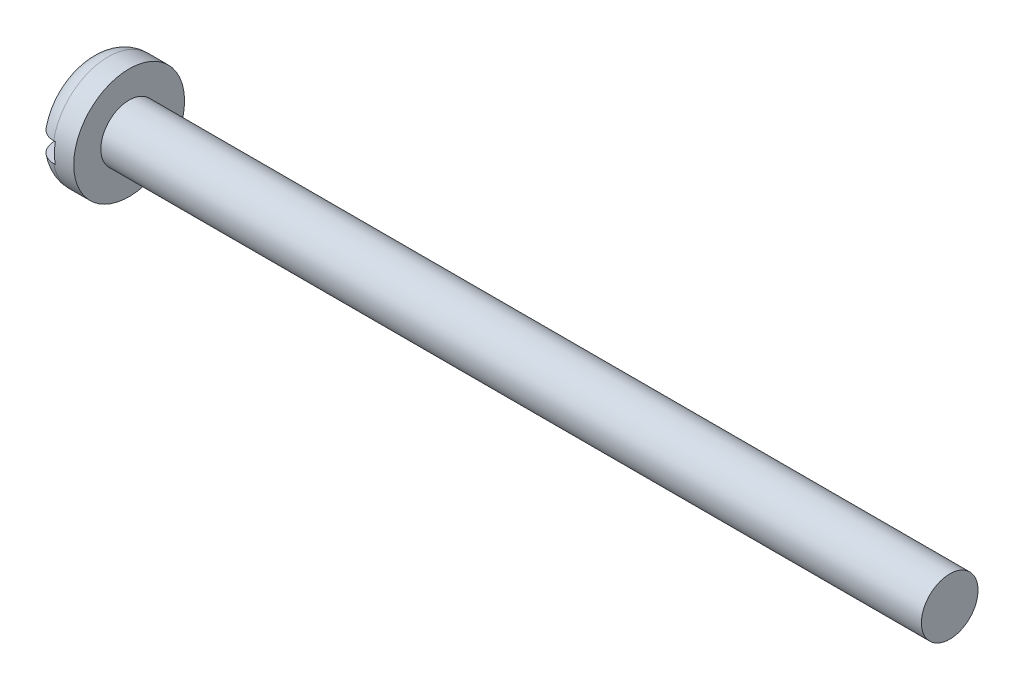
ISO-10303-21;
HEADER;
FILE_DESCRIPTION(('STEP AP214'),'2;1');
FILE_NAME('part.step','',(''),(''),'','','');
FILE_SCHEMA(('AUTOMOTIVE_DESIGN { 1 0 10303 214 1 1 1 1 }'));
ENDSEC;
DATA;
#1=APPLICATION_CONTEXT('core data for automotive mechanical design processes');
#2=APPLICATION_PROTOCOL_DEFINITION('international standard','automotive_design',2000,#1);
#3=PRODUCT_CONTEXT('',#1,'mechanical');
#4=PRODUCT('Part','Part','',(#3));
#5=PRODUCT_RELATED_PRODUCT_CATEGORY('part','',(#4));
#6=PRODUCT_DEFINITION_FORMATION('','',#4);
#7=PRODUCT_DEFINITION_CONTEXT('part definition',#1,'design');
#8=PRODUCT_DEFINITION('design','',#6,#7);
#9=PRODUCT_DEFINITION_SHAPE('','',#8);
#10=(LENGTH_UNIT() NAMED_UNIT(*) SI_UNIT(.MILLI.,.METRE.));
#11=(NAMED_UNIT(*) PLANE_ANGLE_UNIT() SI_UNIT($,.RADIAN.));
#12=(NAMED_UNIT(*) SI_UNIT($,.STERADIAN.) SOLID_ANGLE_UNIT());
#13=UNCERTAINTY_MEASURE_WITH_UNIT(LENGTH_MEASURE(1.E-05),#10,'distance_accuracy_value','');
#14=(GEOMETRIC_REPRESENTATION_CONTEXT(3) GLOBAL_UNCERTAINTY_ASSIGNED_CONTEXT((#13)) GLOBAL_UNIT_ASSIGNED_CONTEXT((#10,
#11,#12)) REPRESENTATION_CONTEXT('',''));
#15=CARTESIAN_POINT('',(0.,0.,0.));
#16=DIRECTION('',(0.,0.,1.));
#17=DIRECTION('',(1.,0.,0.));
#18=AXIS2_PLACEMENT_3D('',#15,#16,#17);
#19=CARTESIAN_POINT('',(0.,0.,0.));
#20=DIRECTION('',(-1.,0.,0.));
#21=DIRECTION('',(0.,0.,1.));
#22=AXIS2_PLACEMENT_3D('',#19,#20,#21);
#23=PLANE('',#22);
#24=DIRECTION('',(0.,0.,-1.));
#25=VECTOR('',#24,1.);
#26=CARTESIAN_POINT('',(0.,0.6096,3.429));
#27=LINE('',#26,#25);
#28=CARTESIAN_POINT('',(0.,0.6096,2.17685557628429));
#29=VERTEX_POINT('',#28);
#30=CARTESIAN_POINT('',(0.,0.6096,-2.17685557628429));
#31=VERTEX_POINT('',#30);
#32=EDGE_CURVE('E225',#29,#31,#27,.T.);
#33=ORIENTED_EDGE('',*,*,#32,.F.);
#34=CARTESIAN_POINT('',(0.,0.,0.));
#35=DIRECTION('',(-1.,0.,0.));
#36=DIRECTION('',(0.,0.,1.));
#37=AXIS2_PLACEMENT_3D('',#34,#35,#36);
#38=CIRCLE('',#37,2.2606);
#39=EDGE_CURVE('E125',#29,#31,#38,.T.);
#40=ORIENTED_EDGE('',*,*,#39,.T.);
#41=EDGE_LOOP('',(#33,#40));
#42=FACE_BOUND('',#41,.T.);
#43=ADVANCED_FACE('F43',(#42),#23,.T.);
#44=CARTESIAN_POINT('',(1.1684,0.,0.));
#45=DIRECTION('',(-1.,0.,0.));
#46=DIRECTION('',(0.,0.,1.));
#47=AXIS2_PLACEMENT_3D('',#44,#45,#46);
#48=TOROIDAL_SURFACE('',#47,2.2606,1.1684);
#49=CARTESIAN_POINT('',(0.427362018272747,0.6096,-3.10465739785107));
#50=CARTESIAN_POINT('',(0.477279718676224,0.6096,-3.14638652143548));
#51=CARTESIAN_POINT('',(0.530707298048855,0.6096,-3.1839478324722));
#52=CARTESIAN_POINT('',(0.643122246388531,0.6096,-3.24960113285809));
#53=CARTESIAN_POINT('',(0.702112227967899,0.6096,-3.27768864381138));
#54=CARTESIAN_POINT('',(0.823992739540758,0.6096,-3.3235343973938));
#55=CARTESIAN_POINT('',(0.886883840357672,0.6096,-3.34129112442763));
#56=CARTESIAN_POINT('',(1.01475618152246,0.6096,-3.36592439004993));
#57=CARTESIAN_POINT('',(1.07973720317609,0.6096,-3.37280206329297));
#58=CARTESIAN_POINT('',(1.2095652340566,0.6096,-3.37546396306673));
#59=CARTESIAN_POINT('',(1.27441099623132,0.6096,-3.37130934417068));
#60=CARTESIAN_POINT('',(1.40248118799588,0.6096,-3.35216243660804));
#61=CARTESIAN_POINT('',(1.46570562885577,0.6096,-3.33717022329633));
#62=CARTESIAN_POINT('',(1.58870000308165,0.6096,-3.29681493857649));
#63=CARTESIAN_POINT('',(1.64847240675862,0.6096,-3.27145939090882));
#64=CARTESIAN_POINT('',(1.76294877808587,0.6096,-3.21113553406013));
#65=CARTESIAN_POINT('',(1.81765266448211,0.6096,-3.17616707080888));
#66=CARTESIAN_POINT('',(1.92084160157143,0.6096,-3.09739081032113));
#67=CARTESIAN_POINT('',(1.9692836345097,0.6096,-3.0535266912822));
#68=CARTESIAN_POINT('',(2.05824075957829,0.6096,-2.95839178079511));
#69=CARTESIAN_POINT('',(2.09875546542635,0.6096,-2.90712062862902));
#70=CARTESIAN_POINT('',(2.17136332774733,0.6096,-2.7978553211482));
#71=CARTESIAN_POINT('',(2.20332627868117,0.6096,-2.73977469416346));
#72=CARTESIAN_POINT('',(2.2572992158067,0.6096,-2.61916543900458));
#73=CARTESIAN_POINT('',(2.27930831956883,0.6096,-2.5566364170393));
#74=CARTESIAN_POINT('',(2.31334340874595,0.6096,-2.42733633002899));
#75=CARTESIAN_POINT('',(2.32512067084294,0.6096,-2.36049987821072));
#76=CARTESIAN_POINT('',(2.33768054065026,0.6096,-2.22580718203051));
#77=CARTESIAN_POINT('',(2.33846147246399,0.6096,-2.15795078380108));
#78=CARTESIAN_POINT('',(2.32906836104974,0.6096,-2.02068096297565));
#79=CARTESIAN_POINT('',(2.31852023713677,0.6096,-1.95129324067237));
#80=CARTESIAN_POINT('',(2.2864019127635,0.6096,-1.81512595041803));
#81=CARTESIAN_POINT('',(2.26483013825031,0.6096,-1.74834675640159));
#82=CARTESIAN_POINT('',(2.21030515087098,0.6096,-1.61635024958424));
#83=CARTESIAN_POINT('',(2.17691716882689,0.6096,-1.55131246285437));
#84=CARTESIAN_POINT('',(2.09998927843649,0.6096,-1.42749551187963));
#85=CARTESIAN_POINT('',(2.05644273514828,0.6096,-1.3687204747812));
#86=CARTESIAN_POINT('',(1.95888412727568,0.6096,-1.25748655150856));
#87=CARTESIAN_POINT('',(1.90460301068289,0.6096,-1.20526293543316));
#88=CARTESIAN_POINT('',(1.78768286973924,0.6096,-1.11118523294255));
#89=CARTESIAN_POINT('',(1.72505107169632,0.6096,-1.0693222693501));
#90=CARTESIAN_POINT('',(1.60677627375506,0.6096,-1.00580110921516));
#91=CARTESIAN_POINT('',(1.55241886590833,0.6096,-0.981747276542445));
#92=CARTESIAN_POINT('',(1.44048395606536,0.6096,-0.942998479082735));
#93=CARTESIAN_POINT('',(1.38291079682733,0.6096,-0.928291209350766));
#94=CARTESIAN_POINT('',(1.26573986893926,0.6096,-0.909345421607595));
#95=CARTESIAN_POINT('',(1.20613345833911,0.6096,-0.90515930936786));
#96=CARTESIAN_POINT('',(1.08716328006078,0.6096,-0.907828320184909));
#97=CARTESIAN_POINT('',(1.02779953894633,0.6096,-0.914684621177688));
#98=CARTESIAN_POINT('',(0.91572877697264,0.6096,-0.937843952743579));
#99=CARTESIAN_POINT('',(0.862859818366886,0.6096,-0.953384660581664));
#100=CARTESIAN_POINT('',(0.760094072737839,0.6096,-0.992287200111419));
#101=CARTESIAN_POINT('',(0.710198572801385,0.6096,-1.01565239014371));
#102=CARTESIAN_POINT('',(0.609242226454553,0.6096,-1.07187122603955));
#103=CARTESIAN_POINT('',(0.558588673314767,0.6096,-1.10545326417776));
#104=CARTESIAN_POINT('',(0.462632862779179,0.6096,-1.17953611733901));
#105=CARTESIAN_POINT('',(0.417333163583384,0.6096,-1.22004021746135));
#106=CARTESIAN_POINT('',(0.326089757445337,0.6096,-1.31374767681184));
#107=CARTESIAN_POINT('',(0.28116423334863,0.6096,-1.36794642877656));
#108=CARTESIAN_POINT('',(0.200349890406197,0.6096,-1.48272056169161));
#109=CARTESIAN_POINT('',(0.164464747772861,0.6096,-1.5432985225529));
#110=CARTESIAN_POINT('',(0.100621560813862,0.6096,-1.67356770363217));
#111=CARTESIAN_POINT('',(0.0733491932618051,0.6096,-1.74359705069634));
#112=CARTESIAN_POINT('',(0.0311777073001999,0.6096,-1.88729449798354));
#113=CARTESIAN_POINT('',(0.0162777855984325,0.6096,-1.96096236164351));
#114=CARTESIAN_POINT('',(-0.000271039101076135,0.6096,-2.10847960743197));
#115=CARTESIAN_POINT('',(-0.00214704504060915,0.6096,-2.18230330134887));
#116=CARTESIAN_POINT('',(0.00710166902090015,0.6096,-2.32914782199944));
#117=CARTESIAN_POINT('',(0.0182251897648511,0.6096,-2.4021687221667));
#118=CARTESIAN_POINT('',(0.0526315943729489,0.6096,-2.54201726985683));
#119=CARTESIAN_POINT('',(0.0753815419857236,0.6096,-2.60897623410588));
#120=CARTESIAN_POINT('',(0.132218130586455,0.6096,-2.73786377121243));
#121=CARTESIAN_POINT('',(0.1662950558566,0.6096,-2.79979659879129));
#122=CARTESIAN_POINT('',(0.236502036358304,0.6096,-2.90423170192074));
#123=CARTESIAN_POINT('',(0.270665068279451,0.6096,-2.94806966006389));
#124=CARTESIAN_POINT('',(0.344823287945075,0.6096,-3.03049967566586));
#125=CARTESIAN_POINT('',(0.384817881328771,0.6096,-3.06909226696609));
#126=CARTESIAN_POINT('',(0.427362018272747,0.6096,-3.10465739785107));
#127=B_SPLINE_CURVE_WITH_KNOTS('',3,(#49,#50,#51,#52,#53,#54,#55,#56,#57,#58,#59,#60,#61,#62,
#63,#64,#65,#66,#67,#68,#69,#70,#71,#72,#73,#74,#75,#76,#77,#78,#79,#80,#81,#82,#83,#84,#85,#86,
#87,#88,#89,#90,#91,#92,#93,#94,#95,#96,#97,#98,#99,#100,#101,#102,#103,#104,#105,#106,#107,
#108,#109,#110,#111,#112,#113,#114,#115,#116,#117,#118,#119,#120,#121,#122,#123,#124,#125,#126),
.UNSPECIFIED.,.T.,.F.,(4,2,2,2,2,2,2,2,2,2,2,2,2,2,2,2,2,2,2,2,2,2,2,2,2,2,2,2,2,2,2,2,2,2,2,2,
2,2,4),(0.,0.194990648192631,0.390073342392388,0.585184649319861,0.780275605347284,
0.974287387201556,1.16829782008545,1.36216765163269,1.55604059059412,1.75118164859478,
1.94633221304919,2.14430381349628,2.34229296110477,2.54497016199081,2.74767825157787,
2.95729146790326,3.16693462299657,3.38526904019226,3.60374646112712,3.82861965333682,
4.05329949821382,4.23089934821778,4.40826489728285,4.58651216687883,4.76477845204487,
4.92941546601602,5.0941232344895,5.27575939693918,5.45748200159625,5.66777115841878,
5.87814569043052,6.10250734020681,6.32685442196116,6.54727942658719,6.76768409775107,
6.97878765953397,7.18971061245122,7.35591526086911,7.52210298130594),.UNSPECIFIED.);
#128=CARTESIAN_POINT('',(1.1684,0.6096,-3.37437828940384));
#129=VERTEX_POINT('',#128);
#130=EDGE_CURVE('E66',#31,#129,#127,.T.);
#131=ORIENTED_EDGE('',*,*,#130,.F.);
#132=ORIENTED_EDGE('',*,*,#39,.F.);
#133=CARTESIAN_POINT('',(1.02403200360655,0.6096,0.917020516747047));
#134=CARTESIAN_POINT('',(1.07958080928296,0.6096,0.908719921760723));
#135=CARTESIAN_POINT('',(1.13586921573091,0.6096,0.905170218084889));
#136=CARTESIAN_POINT('',(1.24822381817624,0.6096,0.90790615184426));
#137=CARTESIAN_POINT('',(1.30428987837066,0.6096,0.914197080377248));
#138=CARTESIAN_POINT('',(1.4143557337311,0.6096,0.936035444422252));
#139=CARTESIAN_POINT('',(1.46836200430162,0.6096,0.951550791913723));
#140=CARTESIAN_POINT('',(1.57331364903198,0.6096,0.990747558146458));
#141=CARTESIAN_POINT('',(1.62425728122433,0.6096,1.01443357355173));
#142=CARTESIAN_POINT('',(1.72611196278834,0.6096,1.07097513641394));
#143=CARTESIAN_POINT('',(1.77670065119183,0.6096,1.1044084902726));
#144=CARTESIAN_POINT('',(1.872554423639,0.6096,1.17817325262752));
#145=CARTESIAN_POINT('',(1.91781743422272,0.6096,1.21850733290181));
#146=CARTESIAN_POINT('',(2.00910317793821,0.6096,1.31191738992792));
#147=CARTESIAN_POINT('',(2.05410033340119,0.6096,1.3659996285422));
#148=CARTESIAN_POINT('',(2.13508157546339,0.6096,1.48055121486685));
#149=CARTESIAN_POINT('',(2.17106179524015,0.6096,1.5410232870438));
#150=CARTESIAN_POINT('',(2.23514202942125,0.6096,1.67112075639808));
#151=CARTESIAN_POINT('',(2.26255232150302,0.6096,1.74108798648912));
#152=CARTESIAN_POINT('',(2.30501312173554,0.6096,1.88468576107671));
#153=CARTESIAN_POINT('',(2.32006423213244,0.6096,1.95831612688817));
#154=CARTESIAN_POINT('',(2.33692470231324,0.6096,2.10581381027556));
#155=CARTESIAN_POINT('',(2.33895620537622,0.6096,2.17965552180773));
#156=CARTESIAN_POINT('',(2.33001373864447,0.6096,2.32655302538113));
#157=CARTESIAN_POINT('',(2.31904259674555,0.6096,2.3996089848262));
#158=CARTESIAN_POINT('',(2.28492773553054,0.6096,2.53953938258562));
#159=CARTESIAN_POINT('',(2.26232018037804,0.6096,2.60654457993351));
#160=CARTESIAN_POINT('',(2.20575268919465,0.6096,2.73558117132036));
#161=CARTESIAN_POINT('',(2.17179520663554,0.6096,2.79761363670639));
#162=CARTESIAN_POINT('',(2.0948779577335,0.6096,2.91253940390139));
#163=CARTESIAN_POINT('',(2.05229414694668,0.6096,2.96568449616117));
#164=CARTESIAN_POINT('',(1.95859972579043,0.6096,3.06383699527283));
#165=CARTESIAN_POINT('',(1.90749040777532,0.6096,3.10884563335227));
#166=CARTESIAN_POINT('',(1.79960095664339,0.6096,3.18827939653179));
#167=CARTESIAN_POINT('',(1.74299559901276,0.6096,3.22294205301761));
#168=CARTESIAN_POINT('',(1.62470163590207,0.6096,3.28210408503277));
#169=CARTESIAN_POINT('',(1.56301350404643,0.6096,3.30660440623068));
#170=CARTESIAN_POINT('',(1.43730388196582,0.6096,3.34439302107398));
#171=CARTESIAN_POINT('',(1.37333117113848,0.6096,3.3578437300276));
#172=CARTESIAN_POINT('',(1.24403324653943,0.6096,3.37373461472145));
#173=CARTESIAN_POINT('',(1.17870809793959,0.6096,3.37617531978173));
#174=CARTESIAN_POINT('',(1.04902074507433,0.6096,3.36999319676055));
#175=CARTESIAN_POINT('',(0.984655026754167,0.6096,3.36144375350918));
#176=CARTESIAN_POINT('',(0.858272331598194,0.6096,3.33366648955928));
#177=CARTESIAN_POINT('',(0.796255327476082,0.6096,3.31443879295656));
#178=CARTESIAN_POINT('',(0.676269707821255,0.6096,3.26586462699113));
#179=CARTESIAN_POINT('',(0.618304056866943,0.6096,3.23651083918636));
#180=CARTESIAN_POINT('',(0.508072649884757,0.6096,3.16856190426301));
#181=CARTESIAN_POINT('',(0.455807024241353,0.6096,3.12996654581387));
#182=CARTESIAN_POINT('',(0.35798745206976,0.6096,3.04432212478907));
#183=CARTESIAN_POINT('',(0.312490966396723,0.6096,2.99720746441982));
#184=CARTESIAN_POINT('',(0.229906031748549,0.6096,2.89611501305507));
#185=CARTESIAN_POINT('',(0.192818051946822,0.6096,2.842136839355));
#186=CARTESIAN_POINT('',(0.127429667467163,0.6096,2.72793466290965));
#187=CARTESIAN_POINT('',(0.0992812769299127,0.6096,2.66762367885954));
#188=CARTESIAN_POINT('',(0.053229072706408,0.6096,2.54321540656954));
#189=CARTESIAN_POINT('',(0.0353262845523346,0.6096,2.47911774001035));
#190=CARTESIAN_POINT('',(0.00974317801359208,0.6096,2.3472060973146));
#191=CARTESIAN_POINT('',(0.00233752181998959,0.6096,2.27933894335188));
#192=CARTESIAN_POINT('',(-0.00139344622749215,0.6096,2.1433061485342));
#193=CARTESIAN_POINT('',(0.00228305211598659,0.6096,2.07514046073167));
#194=CARTESIAN_POINT('',(0.0207249181106607,0.6096,1.93782302084449));
#195=CARTESIAN_POINT('',(0.0358856972356265,0.6096,1.86872446770605));
#196=CARTESIAN_POINT('',(0.0771189646938447,0.6096,1.73387253468423));
#197=CARTESIAN_POINT('',(0.103192891119381,0.6096,1.66811959695434));
#198=CARTESIAN_POINT('',(0.166705029568025,0.6096,1.53894212184696));
#199=CARTESIAN_POINT('',(0.20456928809727,0.6096,1.47572689331941));
#200=CARTESIAN_POINT('',(0.290187924252271,0.6096,1.3563013833297));
#201=CARTESIAN_POINT('',(0.337951442028821,0.6096,1.30009765307491));
#202=CARTESIAN_POINT('',(0.443317249627492,0.6096,1.19536028607224));
#203=CARTESIAN_POINT('',(0.50110566586449,0.6096,1.14701324528921));
#204=CARTESIAN_POINT('',(0.624458663422855,0.6096,1.06163952547773));
#205=CARTESIAN_POINT('',(0.690005688625203,0.6096,1.0245879421441));
#206=CARTESIAN_POINT('',(0.800898740512984,0.6096,0.975865809217344));
#207=CARTESIAN_POINT('',(0.844387677470306,0.6096,0.959907303010974));
#208=CARTESIAN_POINT('',(0.933095394322483,0.6096,0.933902152288488));
#209=CARTESIAN_POINT('',(0.978313199016023,0.6096,0.923852225827806));
#210=CARTESIAN_POINT('',(1.02403200360655,0.6096,0.917020516747047));
#211=B_SPLINE_CURVE_WITH_KNOTS('',3,(#133,#134,#135,#136,#137,#138,#139,#140,#141,#142,#143,
#144,#145,#146,#147,#148,#149,#150,#151,#152,#153,#154,#155,#156,#157,#158,#159,#160,#161,#162,
#163,#164,#165,#166,#167,#168,#169,#170,#171,#172,#173,#174,#175,#176,#177,#178,#179,#180,#181,
#182,#183,#184,#185,#186,#187,#188,#189,#190,#191,#192,#193,#194,#195,#196,#197,#198,#199,#200,
#201,#202,#203,#204,#205,#206,#207,#208,#209,#210),.UNSPECIFIED.,.T.,.F.,(4,2,2,2,2,2,2,2,2,2,2,
2,2,2,2,2,2,2,2,2,2,2,2,2,2,2,2,2,2,2,2,2,2,2,2,2,2,2,4),(0.,0.168326137599829,
0.336742811682946,0.504577032200954,0.672505827497569,0.853739336073549,1.03504317290369,
1.24520195744863,1.45545071285141,1.67978999740639,1.90411834956393,2.12460874026637,
2.34505118615064,2.55614143157337,2.76718607587871,2.97048841591322,3.17375996595639,
3.37192351153068,3.57006861261405,3.76524631290239,3.96041462967266,4.15428648778646,
4.34815609289311,4.54216610818716,4.73618056040708,4.93175798211902,5.12734631387334,
5.32610165038576,5.52487687780864,5.72876277111187,5.93268196964496,6.14396066435027,
6.35526720931372,6.5753276933962,6.79559227547205,7.02049861637739,7.24490543483156,
7.38352139098411,7.52206027942095),.UNSPECIFIED.);
#212=CARTESIAN_POINT('',(1.1684,0.6096,3.37437828940384));
#213=VERTEX_POINT('',#212);
#214=EDGE_CURVE('E160',#213,#29,#211,.T.);
#215=ORIENTED_EDGE('',*,*,#214,.F.);
#216=CARTESIAN_POINT('',(1.1684,0.,0.));
#217=DIRECTION('',(-1.,0.,0.));
#218=DIRECTION('',(0.,0.,1.));
#219=AXIS2_PLACEMENT_3D('',#216,#217,#218);
#220=CIRCLE('',#219,3.429);
#221=EDGE_CURVE('E116',#213,#129,#220,.T.);
#222=ORIENTED_EDGE('',*,*,#221,.T.);
#223=EDGE_LOOP('',(#131,#132,#215,#222));
#224=FACE_BOUND('',#223,.T.);
#225=ADVANCED_FACE('F209',(#224),#48,.T.);
#226=CARTESIAN_POINT('',(-25.4,0.,0.));
#227=DIRECTION('',(-1.,0.,0.));
#228=DIRECTION('',(0.,0.,1.));
#229=AXIS2_PLACEMENT_3D('',#226,#227,#228);
#230=CYLINDRICAL_SURFACE('',#229,1.7526);
#231=CARTESIAN_POINT('',(53.2638,0.,0.));
#232=DIRECTION('',(-1.,0.,0.));
#233=DIRECTION('',(0.,0.,1.));
#234=AXIS2_PLACEMENT_3D('',#231,#232,#233);
#235=CIRCLE('',#234,1.7526);
#236=CARTESIAN_POINT('',(53.2638,0.,1.7526));
#237=VERTEX_POINT('',#236);
#238=EDGE_CURVE('E134',#237,#237,#235,.T.);
#239=ORIENTED_EDGE('',*,*,#238,.T.);
#240=EDGE_LOOP('',(#239));
#241=FACE_BOUND('',#240,.T.);
#242=CARTESIAN_POINT('',(2.4638,0.,0.));
#243=DIRECTION('',(-1.,0.,0.));
#244=DIRECTION('',(0.,0.,1.));
#245=AXIS2_PLACEMENT_3D('',#242,#243,#244);
#246=CIRCLE('',#245,1.7526);
#247=CARTESIAN_POINT('',(2.4638,0.,1.7526));
#248=VERTEX_POINT('',#247);
#249=EDGE_CURVE('E195',#248,#248,#246,.T.);
#250=ORIENTED_EDGE('',*,*,#249,.F.);
#251=EDGE_LOOP('',(#250));
#252=FACE_BOUND('',#251,.T.);
#253=ADVANCED_FACE('F45',(#241,#252),#230,.T.);
#254=CARTESIAN_POINT('',(53.2638,1.7526,0.));
#255=DIRECTION('',(1.,0.,0.));
#256=DIRECTION('',(0.,0.,-1.));
#257=AXIS2_PLACEMENT_3D('',#254,#255,#256);
#258=PLANE('',#257);
#259=ORIENTED_EDGE('',*,*,#238,.F.);
#260=EDGE_LOOP('',(#259));
#261=FACE_BOUND('',#260,.T.);
#262=ADVANCED_FACE('F217',(#261),#258,.T.);
#263=DIRECTION('',(0.,0.,1.));
#264=VECTOR('',#263,1.);
#265=CARTESIAN_POINT('',(0.,-0.6096,-3.429));
#266=LINE('',#265,#264);
#267=CARTESIAN_POINT('',(0.,-0.6096,-2.17685557628429));
#268=VERTEX_POINT('',#267);
#269=CARTESIAN_POINT('',(0.,-0.6096,2.17685557628429));
#270=VERTEX_POINT('',#269);
#271=EDGE_CURVE('E110',#268,#270,#266,.T.);
#272=ORIENTED_EDGE('',*,*,#271,.F.);
#273=EDGE_CURVE('E119',#268,#270,#38,.T.);
#274=ORIENTED_EDGE('',*,*,#273,.T.);
#275=EDGE_LOOP('',(#272,#274));
#276=FACE_BOUND('',#275,.T.);
#277=ADVANCED_FACE('F211',(#276),#23,.T.);
#278=CARTESIAN_POINT('',(0.427362018272747,-0.6096,-3.10465739785107));
#279=CARTESIAN_POINT('',(0.376202058669241,-0.6096,-3.06188443795394));
#280=CARTESIAN_POINT('',(0.328688848429638,-0.6096,-3.01469918821735));
#281=CARTESIAN_POINT('',(0.242298823411142,-0.6096,-2.9129531669692));
#282=CARTESIAN_POINT('',(0.20342944785723,-0.6096,-2.85838610683227));
#283=CARTESIAN_POINT('',(0.135401765232307,-0.6096,-2.74359920454728));
#284=CARTESIAN_POINT('',(0.106231227073374,-0.6096,-2.68338660578094));
#285=CARTESIAN_POINT('',(0.0582072195120839,-0.6096,-2.55900016806158));
#286=CARTESIAN_POINT('',(0.0393523985664715,-0.6096,-2.49482684926024));
#287=CARTESIAN_POINT('',(0.0120218756441579,-0.6096,-2.36301857668841));
#288=CARTESIAN_POINT('',(0.0037536294579668,-0.6096,-2.29534070704595));
#289=CARTESIAN_POINT('',(-0.00171850895013367,-0.6096,-2.15954267725027));
#290=CARTESIAN_POINT('',(0.00107961539686435,-0.6096,-2.09142243874448));
#291=CARTESIAN_POINT('',(0.0177389866501797,-0.6096,-1.95407737095947));
#292=CARTESIAN_POINT('',(0.031992460367863,-0.6096,-1.88490021727515));
#293=CARTESIAN_POINT('',(0.0714357509090305,-0.6096,-1.74974535556365));
#294=CARTESIAN_POINT('',(0.0966271678556735,-0.6096,-1.68376811722596));
#295=CARTESIAN_POINT('',(0.158383940764903,-0.6096,-1.55398238095412));
#296=CARTESIAN_POINT('',(0.195378432974264,-0.6096,-1.49037793010807));
#297=CARTESIAN_POINT('',(0.279306444714808,-0.6096,-1.37003440963406));
#298=CARTESIAN_POINT('',(0.326247455500713,-0.6096,-1.31330056552554));
#299=CARTESIAN_POINT('',(0.430099244261584,-0.6096,-1.20723598756152));
#300=CARTESIAN_POINT('',(0.487211654093989,-0.6096,-1.15810191075458));
#301=CARTESIAN_POINT('',(0.609358298491771,-0.6096,-1.07093393521691));
#302=CARTESIAN_POINT('',(0.674382395977317,-0.6096,-1.03288603994316));
#303=CARTESIAN_POINT('',(0.795042739226763,-0.6096,-0.97760043445933));
#304=CARTESIAN_POINT('',(0.849410969307257,-0.6096,-0.957591157026062));
#305=CARTESIAN_POINT('',(0.960703806232336,-0.6096,-0.926939495774852));
#306=CARTESIAN_POINT('',(1.01762491151311,-0.6096,-0.916284670726106));
#307=CARTESIAN_POINT('',(1.13267302598941,-0.6096,-0.905191866947174));
#308=CARTESIAN_POINT('',(1.19080355309757,-0.6096,-0.904789708048251));
#309=CARTESIAN_POINT('',(1.30621905121183,-0.6096,-0.914333789088867));
#310=CARTESIAN_POINT('',(1.36350363364065,-0.6096,-0.924284643296847));
#311=CARTESIAN_POINT('',(1.4728780764096,-0.6096,-0.952974162446966));
#312=CARTESIAN_POINT('',(1.52508546456413,-0.6096,-0.97127403951429));
#313=CARTESIAN_POINT('',(1.62620522639953,-0.6096,-1.01538958011062));
#314=CARTESIAN_POINT('',(1.67511634294233,-0.6096,-1.04120809135789));
#315=CARTESIAN_POINT('',(1.77487345232104,-0.6096,-1.10297974631261));
#316=CARTESIAN_POINT('',(1.82517994760059,-0.6096,-1.13980230808517));
#317=CARTESIAN_POINT('',(1.91993020650614,-0.6096,-1.22034005921454));
#318=CARTESIAN_POINT('',(1.96437091356278,-0.6096,-1.26405881622896));
#319=CARTESIAN_POINT('',(2.05278454535577,-0.6096,-1.36420928594011));
#320=CARTESIAN_POINT('',(2.09571575643079,-0.6096,-1.42156491605851));
#321=CARTESIAN_POINT('',(2.17189645739658,-0.6096,-1.54239365737703));
#322=CARTESIAN_POINT('',(2.20514276983106,-0.6096,-1.60586876720785));
#323=CARTESIAN_POINT('',(2.26237084631698,-0.6096,-1.74062499213711));
#324=CARTESIAN_POINT('',(2.28581230879446,-0.6096,-1.81213700423834));
#325=CARTESIAN_POINT('',(2.32001666345053,-0.6096,-1.95813957170524));
#326=CARTESIAN_POINT('',(2.33078074897078,-0.6096,-2.03262984603972));
#327=CARTESIAN_POINT('',(2.33890331632224,-0.6096,-2.18046995861414));
#328=CARTESIAN_POINT('',(2.33659178906509,-0.6096,-2.25380143320686));
#329=CARTESIAN_POINT('',(2.31911696615396,-0.6096,-2.3989219805828));
#330=CARTESIAN_POINT('',(2.30395658149576,-0.6096,-2.47071139895228));
#331=CARTESIAN_POINT('',(2.26194382228608,-0.6096,-2.60743385718091));
#332=CARTESIAN_POINT('',(2.23561785994883,-0.6096,-2.67252874469606));
#333=CARTESIAN_POINT('',(2.17202573507572,-0.6096,-2.79713812443027));
#334=CARTESIAN_POINT('',(2.13476182135617,-0.6096,-2.85665376041468));
#335=CARTESIAN_POINT('',(2.05178973218998,-0.6096,-2.96623312685659));
#336=CARTESIAN_POINT('',(2.0064205532078,-0.6096,-3.01655371169077));
#337=CARTESIAN_POINT('',(1.90769862284793,-0.6096,-3.10863746449454));
#338=CARTESIAN_POINT('',(1.85434699500556,-0.6096,-3.15040183480049));
#339=CARTESIAN_POINT('',(1.74253024284295,-0.6096,-3.22318960497348));
#340=CARTESIAN_POINT('',(1.68421302868996,-0.6096,-3.25444036636275));
#341=CARTESIAN_POINT('',(1.5631094501669,-0.6096,-3.30655308678869));
#342=CARTESIAN_POINT('',(1.50032355768085,-0.6096,-3.32741614089285));
#343=CARTESIAN_POINT('',(1.37298079504085,-0.6096,-3.35789911690043));
#344=CARTESIAN_POINT('',(1.30845939639781,-0.6096,-3.36766739007224));
#345=CARTESIAN_POINT('',(1.17868411665979,-0.6096,-3.37616939730721));
#346=CARTESIAN_POINT('',(1.11343015994397,-0.6096,-3.37490198151559));
#347=CARTESIAN_POINT('',(0.984406778630737,-0.6096,-3.36140556598889));
#348=CARTESIAN_POINT('',(0.920631501018399,-0.6096,-3.34923222454245));
#349=CARTESIAN_POINT('',(0.796059420504089,-0.6096,-3.31437097042469));
#350=CARTESIAN_POINT('',(0.735260444483645,-0.6096,-3.29169085970289));
#351=CARTESIAN_POINT('',(0.632047953805627,-0.6096,-3.24299854023121));
#352=CARTESIAN_POINT('',(0.588664758009207,-0.6096,-3.21901262827672));
#353=CARTESIAN_POINT('',(0.505305498999503,-0.6096,-3.16571373153931));
#354=CARTESIAN_POINT('',(0.4653295141775,-0.6096,-3.13640062423973));
#355=CARTESIAN_POINT('',(0.427362018272747,-0.6096,-3.10465739785107));
#356=B_SPLINE_CURVE_WITH_KNOTS('',3,(#278,#279,#280,#281,#282,#283,#284,#285,#286,#287,#288,
#289,#290,#291,#292,#293,#294,#295,#296,#297,#298,#299,#300,#301,#302,#303,#304,#305,#306,#307,
#308,#309,#310,#311,#312,#313,#314,#315,#316,#317,#318,#319,#320,#321,#322,#323,#324,#325,#326,
#327,#328,#329,#330,#331,#332,#333,#334,#335,#336,#337,#338,#339,#340,#341,#342,#343,#344,#345,
#346,#347,#348,#349,#350,#351,#352,#353,#354,#355),.UNSPECIFIED.,.T.,.F.,(4,2,2,2,2,2,2,2,2,2,2,
2,2,2,2,2,2,2,2,2,2,2,2,2,2,2,2,2,2,2,2,2,2,2,2,2,2,2,4),(0.,0.199871516996784,
0.399914391243247,0.599704028413869,0.799467483300359,1.00308845127296,1.20674652577741,
1.41769093252947,1.62866620896228,1.84840840850525,2.06831669966089,2.29320306592302,
2.51780426569654,2.69088483566721,2.86373486177143,3.03718869310885,3.21071986478501,
3.37602764790291,3.54139812374054,3.72771284068449,3.91412426318841,4.12811160914254,
4.34216908196745,4.56682657038519,4.79146290974568,5.01045578289449,5.22939905498149,
5.43900150043361,5.64856088227934,5.85082744449442,6.05306556428294,6.25059681564132,
6.44810723893143,6.64294440475741,6.83780187172885,7.03167051505458,7.22539542867681,
7.37372327174123,7.52205452653237),.UNSPECIFIED.);
#357=CARTESIAN_POINT('',(1.1684,-0.6096,-3.37437828940384));
#358=VERTEX_POINT('',#357);
#359=EDGE_CURVE('E154',#358,#268,#356,.T.);
#360=ORIENTED_EDGE('',*,*,#359,.F.);
#361=CARTESIAN_POINT('',(1.1684,-0.6096,3.37437828940384));
#362=VERTEX_POINT('',#361);
#363=EDGE_CURVE('E120',#358,#362,#220,.T.);
#364=ORIENTED_EDGE('',*,*,#363,.T.);
#365=CARTESIAN_POINT('',(1.02403200360655,-0.6096,0.917020516747047));
#366=CARTESIAN_POINT('',(0.962942740299145,-0.6096,0.926159904920196));
#367=CARTESIAN_POINT('',(0.902674464546113,-0.6096,0.94105676681821));
#368=CARTESIAN_POINT('',(0.785597937859125,-0.6096,0.981081684822092));
#369=CARTESIAN_POINT('',(0.728796859315828,-0.6096,1.00623017469451));
#370=CARTESIAN_POINT('',(0.620282247247118,-0.6096,1.06498267102373));
#371=CARTESIAN_POINT('',(0.5685375154056,-0.6096,1.09852958354232));
#372=CARTESIAN_POINT('',(0.470540678690502,-0.6096,1.17279985628347));
#373=CARTESIAN_POINT('',(0.424287761585041,-0.6096,1.213522153058));
#374=CARTESIAN_POINT('',(0.332019884732529,-0.6096,1.30703598518306));
#375=CARTESIAN_POINT('',(0.286903386086759,-0.6096,1.36071652855671));
#376=CARTESIAN_POINT('',(0.205590942436722,-0.6096,1.47447275958613));
#377=CARTESIAN_POINT('',(0.169399044436518,-0.6096,1.53455133091421));
#378=CARTESIAN_POINT('',(0.104682210589877,-0.6096,1.66405702183523));
#379=CARTESIAN_POINT('',(0.0768736242346693,-0.6096,1.73384432367254));
#380=CARTESIAN_POINT('',(0.0335781048515706,-0.6096,1.87715176195623));
#381=CARTESIAN_POINT('',(0.0180908834325675,-0.6096,1.95067181099192));
#382=CARTESIAN_POINT('',(0.000331263062431294,-0.6096,2.09809530899851));
#383=CARTESIAN_POINT('',(-0.00215116264198966,-0.6096,2.17197324987509));
#384=CARTESIAN_POINT('',(0.00590185956738235,-0.6096,2.31902130974652));
#385=CARTESIAN_POINT('',(0.0164343572570084,-0.6096,2.39219158536634));
#386=CARTESIAN_POINT('',(0.049719029460377,-0.6096,2.53242605440811));
#387=CARTESIAN_POINT('',(0.0719347712404271,-0.6096,2.59961760760181));
#388=CARTESIAN_POINT('',(0.127759542744581,-0.6096,2.72909152083824));
#389=CARTESIAN_POINT('',(0.161366142578038,-0.6096,2.79137492439484));
#390=CARTESIAN_POINT('',(0.237639182220262,-0.6096,2.90683682156451));
#391=CARTESIAN_POINT('',(0.279925833179594,-0.6096,2.96026637186964));
#392=CARTESIAN_POINT('',(0.373081038240863,-0.6096,3.05903287700608));
#393=CARTESIAN_POINT('',(0.423948272166959,-0.6096,3.10437107453714));
#394=CARTESIAN_POINT('',(0.531411143022927,-0.6096,3.18448150156777));
#395=CARTESIAN_POINT('',(0.587829108116132,-0.6096,3.21949221244456));
#396=CARTESIAN_POINT('',(0.705811154554102,-0.6096,3.2793754538815));
#397=CARTESIAN_POINT('',(0.767374753478197,-0.6096,3.30424893355961));
#398=CARTESIAN_POINT('',(0.892892981820766,-0.6096,3.34278825892513));
#399=CARTESIAN_POINT('',(0.95679732457981,-0.6096,3.3566180249649));
#400=CARTESIAN_POINT('',(1.08602366792095,-0.6096,3.37327156025144));
#401=CARTESIAN_POINT('',(1.15134559906103,-0.6096,3.37609586739355));
#402=CARTESIAN_POINT('',(1.28108230184195,-0.6096,3.37067156676981));
#403=CARTESIAN_POINT('',(1.34550022118998,-0.6096,3.36249785792622));
#404=CARTESIAN_POINT('',(1.47204923423691,-0.6096,3.33545659617823));
#405=CARTESIAN_POINT('',(1.53418035550721,-0.6096,3.3165891722505));
#406=CARTESIAN_POINT('',(1.65444455081745,-0.6096,3.26871271901258));
#407=CARTESIAN_POINT('',(1.71257520376442,-0.6096,3.2396976117863));
#408=CARTESIAN_POINT('',(1.8231898165667,-0.6096,3.17239262424124));
#409=CARTESIAN_POINT('',(1.87567365336273,-0.6096,3.13410254185495));
#410=CARTESIAN_POINT('',(1.97397101593468,-0.6096,3.04903468599419));
#411=CARTESIAN_POINT('',(2.01972839000287,-0.6096,3.00219205953029));
#412=CARTESIAN_POINT('',(2.10287512011164,-0.6096,2.90159577872075));
#413=CARTESIAN_POINT('',(2.14026400143629,-0.6096,2.84784173258612));
#414=CARTESIAN_POINT('',(2.20628460990816,-0.6096,2.73404622541054));
#415=CARTESIAN_POINT('',(2.23476623265445,-0.6096,2.67391773491502));
#416=CARTESIAN_POINT('',(2.28150821220852,-0.6096,2.54981717197389));
#417=CARTESIAN_POINT('',(2.29976759672801,-0.6096,2.48584473455182));
#418=CARTESIAN_POINT('',(2.32608354718128,-0.6096,2.35413825489205));
#419=CARTESIAN_POINT('',(2.33386770649924,-0.6096,2.28634987367199));
#420=CARTESIAN_POINT('',(2.33836152110918,-0.6096,2.15041192141763));
#421=CARTESIAN_POINT('',(2.3350692946897,-0.6096,2.08226229097615));
#422=CARTESIAN_POINT('',(2.31740662954036,-0.6096,1.94492761035209));
#423=CARTESIAN_POINT('',(2.3026425555159,-0.6096,1.87579328121981));
#424=CARTESIAN_POINT('',(2.26219183510752,-0.6096,1.74080633962753));
#425=CARTESIAN_POINT('',(2.2365037157984,-0.6096,1.67495417105028));
#426=CARTESIAN_POINT('',(2.17375734784597,-0.6096,1.5455053922018));
#427=CARTESIAN_POINT('',(2.13627122072966,-0.6096,1.48211601843511));
#428=CARTESIAN_POINT('',(2.05139027984153,-0.6096,1.36228631642093));
#429=CARTESIAN_POINT('',(2.00398776698779,-0.6096,1.30585144206726));
#430=CARTESIAN_POINT('',(1.89929766691928,-0.6096,1.20054614610656));
#431=CARTESIAN_POINT('',(1.84181935999154,-0.6096,1.15186457769113));
#432=CARTESIAN_POINT('',(1.71899815444336,-0.6096,1.06569725601217));
#433=CARTESIAN_POINT('',(1.65366496537663,-0.6096,1.0281978759052));
#434=CARTESIAN_POINT('',(1.53268445917082,-0.6096,0.974048877621119));
#435=CARTESIAN_POINT('',(1.47829411297122,-0.6096,0.954582572770541));
#436=CARTESIAN_POINT('',(1.36706863435379,-0.6096,0.925043193605858));
#437=CARTESIAN_POINT('',(1.31023895023582,-0.6096,0.914950220406914));
#438=CARTESIAN_POINT('',(1.2148689412666,-0.6096,0.906608242080936));
#439=CARTESIAN_POINT('',(1.17655729135397,-0.6096,0.905529898659981));
#440=CARTESIAN_POINT('',(1.10006929467007,-0.6096,0.90790346930071));
#441=CARTESIAN_POINT('',(1.06189297505737,-0.6096,0.911356246203132));
#442=CARTESIAN_POINT('',(1.02403200360655,-0.6096,0.917020516747047));
#443=B_SPLINE_CURVE_WITH_KNOTS('',3,(#365,#366,#367,#368,#369,#370,#371,#372,#373,#374,#375,
#376,#377,#378,#379,#380,#381,#382,#383,#384,#385,#386,#387,#388,#389,#390,#391,#392,#393,#394,
#395,#396,#397,#398,#399,#400,#401,#402,#403,#404,#405,#406,#407,#408,#409,#410,#411,#412,#413,
#414,#415,#416,#417,#418,#419,#420,#421,#422,#423,#424,#425,#426,#427,#428,#429,#430,#431,#432,
#433,#434,#435,#436,#437,#438,#439,#440,#441,#442),.UNSPECIFIED.,.T.,.F.,(4,2,2,2,2,2,2,2,2,2,2,
2,2,2,2,2,2,2,2,2,2,2,2,2,2,2,2,2,2,2,2,2,2,2,2,2,2,2,4),(0.,0.185148469698008,
0.370667799988288,0.554958648211398,0.739222206029268,0.948697596501538,1.15826780300432,
1.38254611645579,1.60681918034475,1.82745882485723,2.04804846392609,2.25929547315463,
2.47049744763581,2.67391116349848,2.87729361139845,3.07552598549033,3.27373979542488,
3.468953818781,3.66415830086925,3.85804010345208,4.05191956768027,4.24591535470371,
4.43991536856016,4.63545265701193,4.83100103481483,5.02968640486765,5.22839066967241,
5.43216834578774,5.63598064241517,5.84711300619174,6.05827384667432,6.27820379339666,
6.49830513170609,6.7231415220527,6.94770279183594,7.12030109328301,7.29253213815039,
7.40725878147101,7.5220072748376),.UNSPECIFIED.);
#444=EDGE_CURVE('E148',#270,#362,#443,.T.);
#445=ORIENTED_EDGE('',*,*,#444,.F.);
#446=ORIENTED_EDGE('',*,*,#273,.F.);
#447=EDGE_LOOP('',(#360,#364,#445,#446));
#448=FACE_BOUND('',#447,.T.);
#449=ADVANCED_FACE('F152',(#448),#48,.T.);
#450=CARTESIAN_POINT('',(-25.4,0.,0.));
#451=DIRECTION('',(-1.,0.,0.));
#452=DIRECTION('',(0.,0.,1.));
#453=AXIS2_PLACEMENT_3D('',#450,#451,#452);
#454=CYLINDRICAL_SURFACE('',#453,3.429);
#455=DIRECTION('',(-1.,0.,0.));
#456=VECTOR('',#455,1.);
#457=CARTESIAN_POINT('',(-25.4,0.6096,3.37437828940384));
#458=LINE('',#457,#456);
#459=CARTESIAN_POINT('',(1.27,0.6096,3.37437828940384));
#460=VERTEX_POINT('',#459);
#461=EDGE_CURVE('E11',#460,#213,#458,.T.);
#462=ORIENTED_EDGE('',*,*,#461,.F.);
#463=CARTESIAN_POINT('',(1.27,0.,0.));
#464=DIRECTION('',(1.,0.,0.));
#465=DIRECTION('',(0.,0.,-1.));
#466=AXIS2_PLACEMENT_3D('',#463,#464,#465);
#467=CIRCLE('',#466,3.429);
#468=CARTESIAN_POINT('',(1.27,-0.6096,3.37437828940384));
#469=VERTEX_POINT('',#468);
#470=EDGE_CURVE('E94',#469,#460,#467,.F.);
#471=ORIENTED_EDGE('',*,*,#470,.F.);
#472=DIRECTION('',(-1.,0.,0.));
#473=VECTOR('',#472,1.);
#474=CARTESIAN_POINT('',(-25.4,-0.6096,3.37437828940384));
#475=LINE('',#474,#473);
#476=EDGE_CURVE('E52',#362,#469,#475,.F.);
#477=ORIENTED_EDGE('',*,*,#476,.F.);
#478=ORIENTED_EDGE('',*,*,#363,.F.);
#479=DIRECTION('',(-1.,0.,0.));
#480=VECTOR('',#479,1.);
#481=CARTESIAN_POINT('',(-25.4,-0.6096,-3.37437828940384));
#482=LINE('',#481,#480);
#483=CARTESIAN_POINT('',(1.27,-0.6096,-3.37437828940384));
#484=VERTEX_POINT('',#483);
#485=EDGE_CURVE('E139',#484,#358,#482,.T.);
#486=ORIENTED_EDGE('',*,*,#485,.F.);
#487=CARTESIAN_POINT('',(1.27,0.6096,-3.37437828940384));
#488=VERTEX_POINT('',#487);
#489=EDGE_CURVE('E105',#488,#484,#467,.F.);
#490=ORIENTED_EDGE('',*,*,#489,.F.);
#491=DIRECTION('',(-1.,0.,0.));
#492=VECTOR('',#491,1.);
#493=CARTESIAN_POINT('',(-25.4,0.6096,-3.37437828940384));
#494=LINE('',#493,#492);
#495=EDGE_CURVE('E103',#129,#488,#494,.F.);
#496=ORIENTED_EDGE('',*,*,#495,.F.);
#497=ORIENTED_EDGE('',*,*,#221,.F.);
#498=EDGE_LOOP('',(#462,#471,#477,#478,#486,#490,#496,#497));
#499=FACE_BOUND('',#498,.T.);
#500=CARTESIAN_POINT('',(2.4638,0.,0.));
#501=DIRECTION('',(-1.,0.,0.));
#502=DIRECTION('',(0.,0.,1.));
#503=AXIS2_PLACEMENT_3D('',#500,#501,#502);
#504=CIRCLE('',#503,3.429);
#505=CARTESIAN_POINT('',(2.4638,0.,3.429));
#506=VERTEX_POINT('',#505);
#507=EDGE_CURVE('E128',#506,#506,#504,.T.);
#508=ORIENTED_EDGE('',*,*,#507,.T.);
#509=EDGE_LOOP('',(#508));
#510=FACE_BOUND('',#509,.T.);
#511=ADVANCED_FACE('F113',(#499,#510),#454,.T.);
#512=CARTESIAN_POINT('',(2.4638,1.7526,0.));
#513=DIRECTION('',(-1.,0.,0.));
#514=DIRECTION('',(0.,0.,1.));
#515=AXIS2_PLACEMENT_3D('',#512,#513,#514);
#516=PLANE('',#515);
#517=ORIENTED_EDGE('',*,*,#507,.F.);
#518=EDGE_LOOP('',(#517));
#519=FACE_BOUND('',#518,.T.);
#520=ORIENTED_EDGE('',*,*,#249,.T.);
#521=EDGE_LOOP('',(#520));
#522=FACE_BOUND('',#521,.T.);
#523=ADVANCED_FACE('F185',(#519,#522),#516,.F.);
#524=CARTESIAN_POINT('',(1.27,0.6096,3.429));
#525=DIRECTION('',(0.,1.,0.));
#526=DIRECTION('',(0.,0.,1.));
#527=AXIS2_PLACEMENT_3D('',#524,#525,#526);
#528=PLANE('',#527);
#529=ORIENTED_EDGE('',*,*,#130,.T.);
#530=ORIENTED_EDGE('',*,*,#495,.T.);
#531=DIRECTION('',(0.,0.,-1.));
#532=VECTOR('',#531,1.);
#533=CARTESIAN_POINT('',(1.27,0.6096,3.429));
#534=LINE('',#533,#532);
#535=EDGE_CURVE('E59',#460,#488,#534,.T.);
#536=ORIENTED_EDGE('',*,*,#535,.F.);
#537=ORIENTED_EDGE('',*,*,#461,.T.);
#538=ORIENTED_EDGE('',*,*,#214,.T.);
#539=ORIENTED_EDGE('',*,*,#32,.T.);
#540=EDGE_LOOP('',(#529,#530,#536,#537,#538,#539));
#541=FACE_BOUND('',#540,.T.);
#542=ADVANCED_FACE('F106',(#541),#528,.F.);
#543=CARTESIAN_POINT('',(1.27,-0.6096,-3.429));
#544=DIRECTION('',(0.,-1.,0.));
#545=DIRECTION('',(0.,0.,-1.));
#546=AXIS2_PLACEMENT_3D('',#543,#544,#545);
#547=PLANE('',#546);
#548=ORIENTED_EDGE('',*,*,#444,.T.);
#549=ORIENTED_EDGE('',*,*,#476,.T.);
#550=DIRECTION('',(0.,0.,1.));
#551=VECTOR('',#550,1.);
#552=CARTESIAN_POINT('',(1.27,-0.6096,-3.429));
#553=LINE('',#552,#551);
#554=EDGE_CURVE('E97',#484,#469,#553,.T.);
#555=ORIENTED_EDGE('',*,*,#554,.F.);
#556=ORIENTED_EDGE('',*,*,#485,.T.);
#557=ORIENTED_EDGE('',*,*,#359,.T.);
#558=ORIENTED_EDGE('',*,*,#271,.T.);
#559=EDGE_LOOP('',(#548,#549,#555,#556,#557,#558));
#560=FACE_BOUND('',#559,.T.);
#561=ADVANCED_FACE('F145',(#560),#547,.F.);
#562=CARTESIAN_POINT('',(1.27,-0.6096,-3.429));
#563=DIRECTION('',(1.,0.,0.));
#564=DIRECTION('',(0.,0.,-1.));
#565=AXIS2_PLACEMENT_3D('',#562,#563,#564);
#566=PLANE('',#565);
#567=ORIENTED_EDGE('',*,*,#554,.T.);
#568=ORIENTED_EDGE('',*,*,#470,.T.);
#569=ORIENTED_EDGE('',*,*,#535,.T.);
#570=ORIENTED_EDGE('',*,*,#489,.T.);
#571=EDGE_LOOP('',(#567,#568,#569,#570));
#572=FACE_BOUND('',#571,.T.);
#573=ADVANCED_FACE('F95',(#572),#566,.F.);
#574=CLOSED_SHELL('',(#43,#225,#253,#262,#277,#449,#511,#523,#542,#561,#573));
#575=MANIFOLD_SOLID_BREP('B2',#574);
#576=ADVANCED_BREP_SHAPE_REPRESENTATION('',(#18,#575),#14);
#577=SHAPE_DEFINITION_REPRESENTATION(#9,#576);
ENDSEC;
END-ISO-10303-21;
